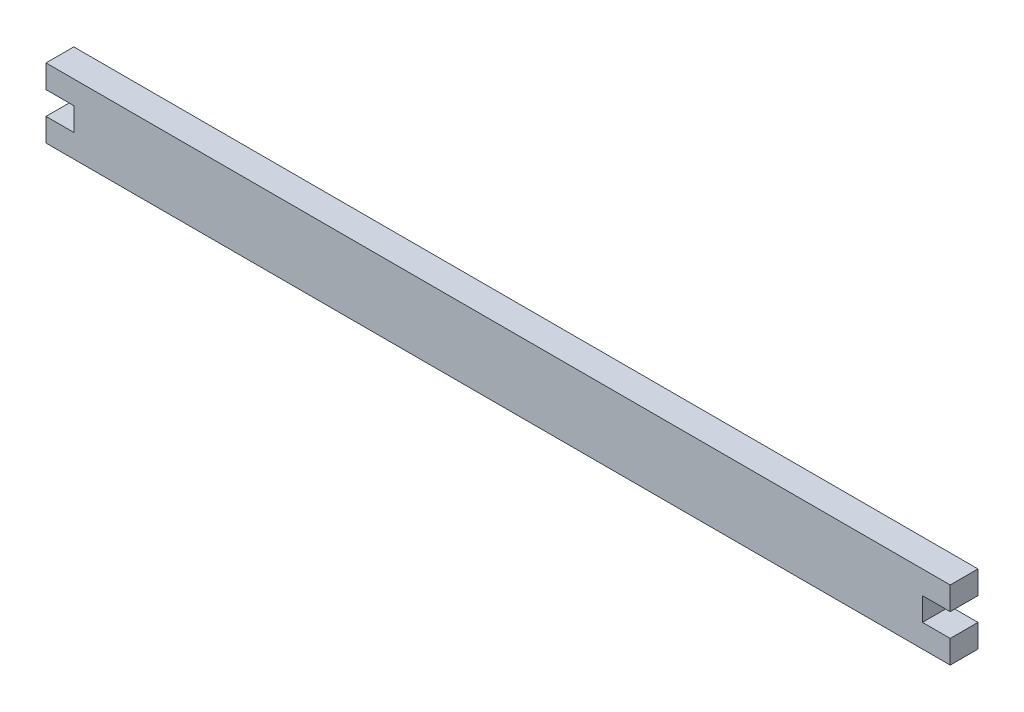
ISO-10303-21;
HEADER;
FILE_DESCRIPTION(('STEP AP214'),'2;1');
FILE_NAME('part.step','',(''),(''),'','','');
FILE_SCHEMA(('AUTOMOTIVE_DESIGN { 1 0 10303 214 1 1 1 1 }'));
ENDSEC;
DATA;
#1=APPLICATION_CONTEXT('core data for automotive mechanical design processes');
#2=APPLICATION_PROTOCOL_DEFINITION('international standard','automotive_design',2000,#1);
#3=PRODUCT_CONTEXT('',#1,'mechanical');
#4=PRODUCT('Part','Part','',(#3));
#5=PRODUCT_RELATED_PRODUCT_CATEGORY('part','',(#4));
#6=PRODUCT_DEFINITION_FORMATION('','',#4);
#7=PRODUCT_DEFINITION_CONTEXT('part definition',#1,'design');
#8=PRODUCT_DEFINITION('design','',#6,#7);
#9=PRODUCT_DEFINITION_SHAPE('','',#8);
#10=(LENGTH_UNIT() NAMED_UNIT(*) SI_UNIT(.MILLI.,.METRE.));
#11=(NAMED_UNIT(*) PLANE_ANGLE_UNIT() SI_UNIT($,.RADIAN.));
#12=(NAMED_UNIT(*) SI_UNIT($,.STERADIAN.) SOLID_ANGLE_UNIT());
#13=UNCERTAINTY_MEASURE_WITH_UNIT(LENGTH_MEASURE(1.E-05),#10,'distance_accuracy_value','');
#14=(GEOMETRIC_REPRESENTATION_CONTEXT(3) GLOBAL_UNCERTAINTY_ASSIGNED_CONTEXT((#13)) GLOBAL_UNIT_ASSIGNED_CONTEXT((#10,
#11,#12)) REPRESENTATION_CONTEXT('',''));
#15=CARTESIAN_POINT('',(0.,0.,0.));
#16=DIRECTION('',(0.,0.,1.));
#17=DIRECTION('',(1.,0.,0.));
#18=AXIS2_PLACEMENT_3D('',#15,#16,#17);
#19=CARTESIAN_POINT('',(293.,22.5,18.));
#20=DIRECTION('',(-1.,0.,0.));
#21=DIRECTION('',(0.,-1.,0.));
#22=AXIS2_PLACEMENT_3D('',#19,#20,#21);
#23=PLANE('',#22);
#24=DIRECTION('',(0.,0.,1.));
#25=VECTOR('',#24,1.);
#26=CARTESIAN_POINT('',(293.,-7.5,-0.001000000000001));
#27=LINE('',#26,#25);
#28=CARTESIAN_POINT('',(293.,-7.49999999999999,0.));
#29=VERTEX_POINT('',#28);
#30=CARTESIAN_POINT('',(293.,-7.5,18.));
#31=VERTEX_POINT('',#30);
#32=EDGE_CURVE('E122',#29,#31,#27,.T.);
#33=ORIENTED_EDGE('',*,*,#32,.T.);
#34=DIRECTION('',(0.,1.,0.));
#35=VECTOR('',#34,1.);
#36=CARTESIAN_POINT('',(293.,22.5,18.));
#37=LINE('',#36,#35);
#38=CARTESIAN_POINT('',(293.,-22.5,18.));
#39=VERTEX_POINT('',#38);
#40=EDGE_CURVE('E207',#39,#31,#37,.T.);
#41=ORIENTED_EDGE('',*,*,#40,.F.);
#42=DIRECTION('',(0.,0.,-1.));
#43=VECTOR('',#42,1.);
#44=CARTESIAN_POINT('',(293.,-22.5,18.));
#45=LINE('',#44,#43);
#46=CARTESIAN_POINT('',(293.,-22.5,0.));
#47=VERTEX_POINT('',#46);
#48=EDGE_CURVE('E148',#39,#47,#45,.T.);
#49=ORIENTED_EDGE('',*,*,#48,.T.);
#50=DIRECTION('',(0.,1.,0.));
#51=VECTOR('',#50,1.);
#52=CARTESIAN_POINT('',(293.,22.5,0.));
#53=LINE('',#52,#51);
#54=EDGE_CURVE('E141',#47,#29,#53,.T.);
#55=ORIENTED_EDGE('',*,*,#54,.T.);
#56=EDGE_LOOP('',(#33,#41,#49,#55));
#57=FACE_BOUND('',#56,.T.);
#58=ADVANCED_FACE('F35',(#57),#23,.F.);
#59=DIRECTION('',(0.,0.,1.));
#60=VECTOR('',#59,1.);
#61=CARTESIAN_POINT('',(293.,7.5,-0.001000000000001));
#62=LINE('',#61,#60);
#63=CARTESIAN_POINT('',(293.,7.5,0.));
#64=VERTEX_POINT('',#63);
#65=CARTESIAN_POINT('',(293.,7.5,18.));
#66=VERTEX_POINT('',#65);
#67=EDGE_CURVE('E229',#64,#66,#62,.T.);
#68=ORIENTED_EDGE('',*,*,#67,.F.);
#69=CARTESIAN_POINT('',(293.,22.5,0.));
#70=VERTEX_POINT('',#69);
#71=EDGE_CURVE('E150',#64,#70,#53,.T.);
#72=ORIENTED_EDGE('',*,*,#71,.T.);
#73=DIRECTION('',(0.,0.,-1.));
#74=VECTOR('',#73,1.);
#75=CARTESIAN_POINT('',(293.,22.5,18.));
#76=LINE('',#75,#74);
#77=CARTESIAN_POINT('',(293.,22.5,18.));
#78=VERTEX_POINT('',#77);
#79=EDGE_CURVE('E11',#78,#70,#76,.T.);
#80=ORIENTED_EDGE('',*,*,#79,.F.);
#81=EDGE_CURVE('E164',#66,#78,#37,.T.);
#82=ORIENTED_EDGE('',*,*,#81,.F.);
#83=EDGE_LOOP('',(#68,#72,#80,#82));
#84=FACE_BOUND('',#83,.T.);
#85=ADVANCED_FACE('F240',(#84),#23,.F.);
#86=CARTESIAN_POINT('',(0.,0.,18.));
#87=DIRECTION('',(0.,0.,1.));
#88=DIRECTION('',(1.,0.,0.));
#89=AXIS2_PLACEMENT_3D('',#86,#87,#88);
#90=PLANE('',#89);
#91=ORIENTED_EDGE('',*,*,#40,.T.);
#92=DIRECTION('',(-1.,0.,0.));
#93=VECTOR('',#92,1.);
#94=CARTESIAN_POINT('',(293.,-7.5,18.));
#95=LINE('',#94,#93);
#96=CARTESIAN_POINT('',(275.,-7.5,18.));
#97=VERTEX_POINT('',#96);
#98=EDGE_CURVE('E128',#31,#97,#95,.T.);
#99=ORIENTED_EDGE('',*,*,#98,.T.);
#100=DIRECTION('',(0.,1.,0.));
#101=VECTOR('',#100,1.);
#102=CARTESIAN_POINT('',(275.,-7.5,18.));
#103=LINE('',#102,#101);
#104=CARTESIAN_POINT('',(275.,7.5,18.));
#105=VERTEX_POINT('',#104);
#106=EDGE_CURVE('E228',#97,#105,#103,.T.);
#107=ORIENTED_EDGE('',*,*,#106,.T.);
#108=DIRECTION('',(1.,0.,0.));
#109=VECTOR('',#108,1.);
#110=CARTESIAN_POINT('',(275.,7.5,18.));
#111=LINE('',#110,#109);
#112=EDGE_CURVE('E144',#105,#66,#111,.T.);
#113=ORIENTED_EDGE('',*,*,#112,.T.);
#114=ORIENTED_EDGE('',*,*,#81,.T.);
#115=DIRECTION('',(-1.,0.,0.));
#116=VECTOR('',#115,1.);
#117=CARTESIAN_POINT('',(-293.,22.5,18.));
#118=LINE('',#117,#116);
#119=CARTESIAN_POINT('',(-293.,22.5,18.));
#120=VERTEX_POINT('',#119);
#121=EDGE_CURVE('E209',#78,#120,#118,.T.);
#122=ORIENTED_EDGE('',*,*,#121,.T.);
#123=DIRECTION('',(0.,-1.,0.));
#124=VECTOR('',#123,1.);
#125=CARTESIAN_POINT('',(-293.,22.5,18.));
#126=LINE('',#125,#124);
#127=CARTESIAN_POINT('',(-293.,7.5,18.));
#128=VERTEX_POINT('',#127);
#129=EDGE_CURVE('E176',#120,#128,#126,.T.);
#130=ORIENTED_EDGE('',*,*,#129,.T.);
#131=DIRECTION('',(-1.,0.,0.));
#132=VECTOR('',#131,1.);
#133=CARTESIAN_POINT('',(-275.,7.5,18.));
#134=LINE('',#133,#132);
#135=CARTESIAN_POINT('',(-275.,7.5,18.));
#136=VERTEX_POINT('',#135);
#137=EDGE_CURVE('E196',#136,#128,#134,.T.);
#138=ORIENTED_EDGE('',*,*,#137,.F.);
#139=DIRECTION('',(0.,1.,0.));
#140=VECTOR('',#139,1.);
#141=CARTESIAN_POINT('',(-275.,-7.5,18.));
#142=LINE('',#141,#140);
#143=CARTESIAN_POINT('',(-275.,-7.5,18.));
#144=VERTEX_POINT('',#143);
#145=EDGE_CURVE('E189',#144,#136,#142,.T.);
#146=ORIENTED_EDGE('',*,*,#145,.F.);
#147=DIRECTION('',(1.,0.,0.));
#148=VECTOR('',#147,1.);
#149=CARTESIAN_POINT('',(-293.,-7.5,18.));
#150=LINE('',#149,#148);
#151=CARTESIAN_POINT('',(-293.,-7.5,18.));
#152=VERTEX_POINT('',#151);
#153=EDGE_CURVE('E186',#152,#144,#150,.T.);
#154=ORIENTED_EDGE('',*,*,#153,.F.);
#155=CARTESIAN_POINT('',(-293.,-22.5,18.));
#156=VERTEX_POINT('',#155);
#157=EDGE_CURVE('E210',#152,#156,#126,.T.);
#158=ORIENTED_EDGE('',*,*,#157,.T.);
#159=DIRECTION('',(1.,0.,0.));
#160=VECTOR('',#159,1.);
#161=CARTESIAN_POINT('',(-293.,-22.5,18.));
#162=LINE('',#161,#160);
#163=EDGE_CURVE('E156',#156,#39,#162,.T.);
#164=ORIENTED_EDGE('',*,*,#163,.T.);
#165=EDGE_LOOP('',(#91,#99,#107,#113,#114,#122,#130,#138,#146,#154,#158,#164));
#166=FACE_BOUND('',#165,.T.);
#167=ADVANCED_FACE('F216',(#166),#90,.T.);
#168=CARTESIAN_POINT('',(0.,0.,0.));
#169=DIRECTION('',(0.,0.,1.));
#170=DIRECTION('',(1.,0.,0.));
#171=AXIS2_PLACEMENT_3D('',#168,#169,#170);
#172=PLANE('',#171);
#173=DIRECTION('',(1.,0.,0.));
#174=VECTOR('',#173,1.);
#175=CARTESIAN_POINT('',(293.,-7.5,0.));
#176=LINE('',#175,#174);
#177=CARTESIAN_POINT('',(275.,-7.5,0.));
#178=VERTEX_POINT('',#177);
#179=EDGE_CURVE('E125',#178,#29,#176,.T.);
#180=ORIENTED_EDGE('',*,*,#179,.T.);
#181=ORIENTED_EDGE('',*,*,#54,.F.);
#182=DIRECTION('',(1.,0.,0.));
#183=VECTOR('',#182,1.);
#184=CARTESIAN_POINT('',(-293.,-22.5,0.));
#185=LINE('',#184,#183);
#186=CARTESIAN_POINT('',(-293.,-22.5,0.));
#187=VERTEX_POINT('',#186);
#188=EDGE_CURVE('E162',#187,#47,#185,.T.);
#189=ORIENTED_EDGE('',*,*,#188,.F.);
#190=DIRECTION('',(0.,-1.,0.));
#191=VECTOR('',#190,1.);
#192=CARTESIAN_POINT('',(-293.,22.5,0.));
#193=LINE('',#192,#191);
#194=CARTESIAN_POINT('',(-293.,-7.49999999999999,0.));
#195=VERTEX_POINT('',#194);
#196=EDGE_CURVE('E152',#195,#187,#193,.T.);
#197=ORIENTED_EDGE('',*,*,#196,.F.);
#198=DIRECTION('',(-1.,0.,0.));
#199=VECTOR('',#198,1.);
#200=CARTESIAN_POINT('',(-293.,-7.5,0.));
#201=LINE('',#200,#199);
#202=CARTESIAN_POINT('',(-275.,-7.5,0.));
#203=VERTEX_POINT('',#202);
#204=EDGE_CURVE('E154',#203,#195,#201,.T.);
#205=ORIENTED_EDGE('',*,*,#204,.F.);
#206=DIRECTION('',(0.,-1.,0.));
#207=VECTOR('',#206,1.);
#208=CARTESIAN_POINT('',(-275.,-7.5,0.));
#209=LINE('',#208,#207);
#210=CARTESIAN_POINT('',(-275.,7.5,0.));
#211=VERTEX_POINT('',#210);
#212=EDGE_CURVE('E57',#211,#203,#209,.T.);
#213=ORIENTED_EDGE('',*,*,#212,.F.);
#214=DIRECTION('',(1.,0.,0.));
#215=VECTOR('',#214,1.);
#216=CARTESIAN_POINT('',(-275.,7.5,0.));
#217=LINE('',#216,#215);
#218=CARTESIAN_POINT('',(-293.,7.5,0.));
#219=VERTEX_POINT('',#218);
#220=EDGE_CURVE('E183',#219,#211,#217,.T.);
#221=ORIENTED_EDGE('',*,*,#220,.F.);
#222=CARTESIAN_POINT('',(-293.,22.5,0.));
#223=VERTEX_POINT('',#222);
#224=EDGE_CURVE('E159',#223,#219,#193,.T.);
#225=ORIENTED_EDGE('',*,*,#224,.F.);
#226=DIRECTION('',(-1.,0.,0.));
#227=VECTOR('',#226,1.);
#228=CARTESIAN_POINT('',(-293.,22.5,0.));
#229=LINE('',#228,#227);
#230=EDGE_CURVE('E149',#70,#223,#229,.T.);
#231=ORIENTED_EDGE('',*,*,#230,.F.);
#232=ORIENTED_EDGE('',*,*,#71,.F.);
#233=DIRECTION('',(-1.,0.,0.));
#234=VECTOR('',#233,1.);
#235=CARTESIAN_POINT('',(275.,7.5,0.));
#236=LINE('',#235,#234);
#237=CARTESIAN_POINT('',(275.,7.5,0.));
#238=VERTEX_POINT('',#237);
#239=EDGE_CURVE('E133',#64,#238,#236,.T.);
#240=ORIENTED_EDGE('',*,*,#239,.T.);
#241=DIRECTION('',(0.,-1.,0.));
#242=VECTOR('',#241,1.);
#243=CARTESIAN_POINT('',(275.,-7.5,0.));
#244=LINE('',#243,#242);
#245=EDGE_CURVE('E143',#238,#178,#244,.T.);
#246=ORIENTED_EDGE('',*,*,#245,.T.);
#247=EDGE_LOOP('',(#180,#181,#189,#197,#205,#213,#221,#225,#231,#232,#240,#246));
#248=FACE_BOUND('',#247,.T.);
#249=ADVANCED_FACE('F139',(#248),#172,.F.);
#250=CARTESIAN_POINT('',(-293.,22.5,18.));
#251=DIRECTION('',(1.,0.,0.));
#252=DIRECTION('',(0.,0.,-1.));
#253=AXIS2_PLACEMENT_3D('',#250,#251,#252);
#254=PLANE('',#253);
#255=ORIENTED_EDGE('',*,*,#224,.T.);
#256=DIRECTION('',(0.,0.,1.));
#257=VECTOR('',#256,1.);
#258=CARTESIAN_POINT('',(-293.,7.5,-0.001000000000001));
#259=LINE('',#258,#257);
#260=EDGE_CURVE('E199',#219,#128,#259,.T.);
#261=ORIENTED_EDGE('',*,*,#260,.T.);
#262=ORIENTED_EDGE('',*,*,#129,.F.);
#263=DIRECTION('',(0.,0.,-1.));
#264=VECTOR('',#263,1.);
#265=CARTESIAN_POINT('',(-293.,22.5,18.));
#266=LINE('',#265,#264);
#267=EDGE_CURVE('E42',#120,#223,#266,.T.);
#268=ORIENTED_EDGE('',*,*,#267,.T.);
#269=EDGE_LOOP('',(#255,#261,#262,#268));
#270=FACE_BOUND('',#269,.T.);
#271=ADVANCED_FACE('F173',(#270),#254,.F.);
#272=CARTESIAN_POINT('',(-293.,22.5,18.));
#273=DIRECTION('',(0.,-1.,0.));
#274=DIRECTION('',(0.,0.,-1.));
#275=AXIS2_PLACEMENT_3D('',#272,#273,#274);
#276=PLANE('',#275);
#277=ORIENTED_EDGE('',*,*,#230,.T.);
#278=ORIENTED_EDGE('',*,*,#267,.F.);
#279=ORIENTED_EDGE('',*,*,#121,.F.);
#280=ORIENTED_EDGE('',*,*,#79,.T.);
#281=EDGE_LOOP('',(#277,#278,#279,#280));
#282=FACE_BOUND('',#281,.T.);
#283=ADVANCED_FACE('F242',(#282),#276,.F.);
#284=ORIENTED_EDGE('',*,*,#157,.F.);
#285=DIRECTION('',(0.,0.,1.));
#286=VECTOR('',#285,1.);
#287=CARTESIAN_POINT('',(-293.,-7.5,-0.001000000000001));
#288=LINE('',#287,#286);
#289=EDGE_CURVE('E198',#195,#152,#288,.T.);
#290=ORIENTED_EDGE('',*,*,#289,.F.);
#291=ORIENTED_EDGE('',*,*,#196,.T.);
#292=DIRECTION('',(0.,0.,-1.));
#293=VECTOR('',#292,1.);
#294=CARTESIAN_POINT('',(-293.,-22.5,18.));
#295=LINE('',#294,#293);
#296=EDGE_CURVE('E166',#156,#187,#295,.T.);
#297=ORIENTED_EDGE('',*,*,#296,.F.);
#298=EDGE_LOOP('',(#284,#290,#291,#297));
#299=FACE_BOUND('',#298,.T.);
#300=ADVANCED_FACE('F221',(#299),#254,.F.);
#301=CARTESIAN_POINT('',(-293.,-22.5,18.));
#302=DIRECTION('',(0.,1.,0.));
#303=DIRECTION('',(0.,0.,1.));
#304=AXIS2_PLACEMENT_3D('',#301,#302,#303);
#305=PLANE('',#304);
#306=ORIENTED_EDGE('',*,*,#188,.T.);
#307=ORIENTED_EDGE('',*,*,#48,.F.);
#308=ORIENTED_EDGE('',*,*,#163,.F.);
#309=ORIENTED_EDGE('',*,*,#296,.T.);
#310=EDGE_LOOP('',(#306,#307,#308,#309));
#311=FACE_BOUND('',#310,.T.);
#312=ADVANCED_FACE('F224',(#311),#305,.F.);
#313=CARTESIAN_POINT('',(-275.,7.5,-0.001000000000001));
#314=DIRECTION('',(0.,1.,0.));
#315=DIRECTION('',(-1.,0.,0.));
#316=AXIS2_PLACEMENT_3D('',#313,#314,#315);
#317=PLANE('',#316);
#318=ORIENTED_EDGE('',*,*,#220,.T.);
#319=DIRECTION('',(0.,0.,1.));
#320=VECTOR('',#319,1.);
#321=CARTESIAN_POINT('',(-275.,7.5,-0.001000000000001));
#322=LINE('',#321,#320);
#323=EDGE_CURVE('E201',#211,#136,#322,.T.);
#324=ORIENTED_EDGE('',*,*,#323,.T.);
#325=ORIENTED_EDGE('',*,*,#137,.T.);
#326=ORIENTED_EDGE('',*,*,#260,.F.);
#327=EDGE_LOOP('',(#318,#324,#325,#326));
#328=FACE_BOUND('',#327,.T.);
#329=ADVANCED_FACE('F266',(#328),#317,.F.);
#330=CARTESIAN_POINT('',(-275.,-7.5,-0.001000000000001));
#331=DIRECTION('',(1.,0.,0.));
#332=DIRECTION('',(0.,1.,0.));
#333=AXIS2_PLACEMENT_3D('',#330,#331,#332);
#334=PLANE('',#333);
#335=ORIENTED_EDGE('',*,*,#212,.T.);
#336=DIRECTION('',(0.,0.,1.));
#337=VECTOR('',#336,1.);
#338=CARTESIAN_POINT('',(-275.,-7.5,-0.001000000000001));
#339=LINE('',#338,#337);
#340=EDGE_CURVE('E203',#203,#144,#339,.T.);
#341=ORIENTED_EDGE('',*,*,#340,.T.);
#342=ORIENTED_EDGE('',*,*,#145,.T.);
#343=ORIENTED_EDGE('',*,*,#323,.F.);
#344=EDGE_LOOP('',(#335,#341,#342,#343));
#345=FACE_BOUND('',#344,.T.);
#346=ADVANCED_FACE('F270',(#345),#334,.F.);
#347=CARTESIAN_POINT('',(-293.,-7.5,-0.001000000000001));
#348=DIRECTION('',(0.,-1.,0.));
#349=DIRECTION('',(1.,0.,0.));
#350=AXIS2_PLACEMENT_3D('',#347,#348,#349);
#351=PLANE('',#350);
#352=ORIENTED_EDGE('',*,*,#204,.T.);
#353=ORIENTED_EDGE('',*,*,#289,.T.);
#354=ORIENTED_EDGE('',*,*,#153,.T.);
#355=ORIENTED_EDGE('',*,*,#340,.F.);
#356=EDGE_LOOP('',(#352,#353,#354,#355));
#357=FACE_BOUND('',#356,.T.);
#358=ADVANCED_FACE('F262',(#357),#351,.F.);
#359=CARTESIAN_POINT('',(293.,-7.5,-0.001000000000001));
#360=DIRECTION('',(0.,1.,0.));
#361=DIRECTION('',(-1.,0.,0.));
#362=AXIS2_PLACEMENT_3D('',#359,#360,#361);
#363=PLANE('',#362);
#364=DIRECTION('',(0.,0.,1.));
#365=VECTOR('',#364,1.);
#366=CARTESIAN_POINT('',(275.,-7.5,-0.001000000000001));
#367=LINE('',#366,#365);
#368=EDGE_CURVE('E134',#178,#97,#367,.T.);
#369=ORIENTED_EDGE('',*,*,#368,.T.);
#370=ORIENTED_EDGE('',*,*,#98,.F.);
#371=ORIENTED_EDGE('',*,*,#32,.F.);
#372=ORIENTED_EDGE('',*,*,#179,.F.);
#373=EDGE_LOOP('',(#369,#370,#371,#372));
#374=FACE_BOUND('',#373,.T.);
#375=ADVANCED_FACE('F124',(#374),#363,.T.);
#376=CARTESIAN_POINT('',(275.,-7.5,-0.001000000000001));
#377=DIRECTION('',(1.,0.,0.));
#378=DIRECTION('',(0.,1.,0.));
#379=AXIS2_PLACEMENT_3D('',#376,#377,#378);
#380=PLANE('',#379);
#381=DIRECTION('',(0.,0.,1.));
#382=VECTOR('',#381,1.);
#383=CARTESIAN_POINT('',(275.,7.5,-0.001000000000001));
#384=LINE('',#383,#382);
#385=EDGE_CURVE('E49',#238,#105,#384,.T.);
#386=ORIENTED_EDGE('',*,*,#385,.T.);
#387=ORIENTED_EDGE('',*,*,#106,.F.);
#388=ORIENTED_EDGE('',*,*,#368,.F.);
#389=ORIENTED_EDGE('',*,*,#245,.F.);
#390=EDGE_LOOP('',(#386,#387,#388,#389));
#391=FACE_BOUND('',#390,.T.);
#392=ADVANCED_FACE('F278',(#391),#380,.T.);
#393=CARTESIAN_POINT('',(275.,7.5,-0.001000000000001));
#394=DIRECTION('',(0.,-1.,0.));
#395=DIRECTION('',(1.,0.,0.));
#396=AXIS2_PLACEMENT_3D('',#393,#394,#395);
#397=PLANE('',#396);
#398=ORIENTED_EDGE('',*,*,#67,.T.);
#399=ORIENTED_EDGE('',*,*,#112,.F.);
#400=ORIENTED_EDGE('',*,*,#385,.F.);
#401=ORIENTED_EDGE('',*,*,#239,.F.);
#402=EDGE_LOOP('',(#398,#399,#400,#401));
#403=FACE_BOUND('',#402,.T.);
#404=ADVANCED_FACE('F237',(#403),#397,.T.);
#405=CLOSED_SHELL('',(#58,#85,#167,#249,#271,#283,#300,#312,#329,#346,#358,#375,#392,#404));
#406=MANIFOLD_SOLID_BREP('B2',#405);
#407=ADVANCED_BREP_SHAPE_REPRESENTATION('',(#18,#406),#14);
#408=SHAPE_DEFINITION_REPRESENTATION(#9,#407);
ENDSEC;
END-ISO-10303-21;
